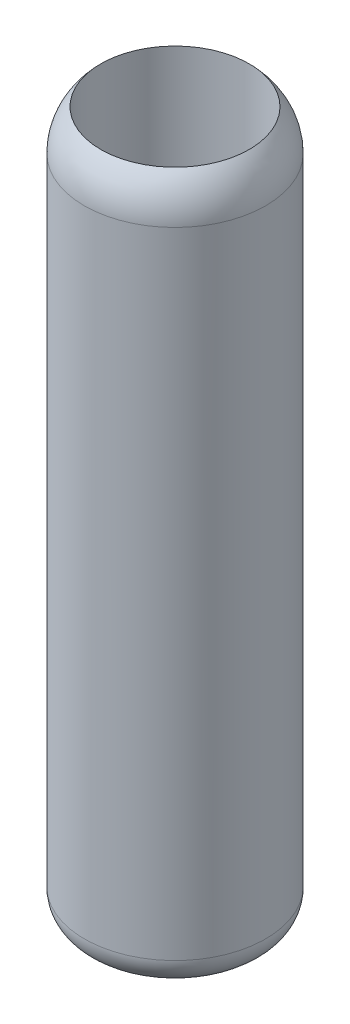
ISO-10303-21;
HEADER;
FILE_DESCRIPTION(('STEP AP214'),'2;1');
FILE_NAME('part.step','',(''),(''),'','','');
FILE_SCHEMA(('AUTOMOTIVE_DESIGN { 1 0 10303 214 1 1 1 1 }'));
ENDSEC;
DATA;
#1=APPLICATION_CONTEXT('core data for automotive mechanical design processes');
#2=APPLICATION_PROTOCOL_DEFINITION('international standard','automotive_design',2000,#1);
#3=PRODUCT_CONTEXT('',#1,'mechanical');
#4=PRODUCT('Part','Part','',(#3));
#5=PRODUCT_RELATED_PRODUCT_CATEGORY('part','',(#4));
#6=PRODUCT_DEFINITION_FORMATION('','',#4);
#7=PRODUCT_DEFINITION_CONTEXT('part definition',#1,'design');
#8=PRODUCT_DEFINITION('design','',#6,#7);
#9=PRODUCT_DEFINITION_SHAPE('','',#8);
#10=(LENGTH_UNIT() NAMED_UNIT(*) SI_UNIT(.MILLI.,.METRE.));
#11=(NAMED_UNIT(*) PLANE_ANGLE_UNIT() SI_UNIT($,.RADIAN.));
#12=(NAMED_UNIT(*) SI_UNIT($,.STERADIAN.) SOLID_ANGLE_UNIT());
#13=UNCERTAINTY_MEASURE_WITH_UNIT(LENGTH_MEASURE(1.E-05),#10,'distance_accuracy_value','');
#14=(GEOMETRIC_REPRESENTATION_CONTEXT(3) GLOBAL_UNCERTAINTY_ASSIGNED_CONTEXT((#13)) GLOBAL_UNIT_ASSIGNED_CONTEXT((#10,
#11,#12)) REPRESENTATION_CONTEXT('',''));
#15=CARTESIAN_POINT('',(0.,0.,0.));
#16=DIRECTION('',(0.,0.,1.));
#17=DIRECTION('',(1.,0.,0.));
#18=AXIS2_PLACEMENT_3D('',#15,#16,#17);
#19=CARTESIAN_POINT('',(0.,120.,0.));
#20=DIRECTION('',(0.,-1.,0.));
#21=DIRECTION('',(0.,0.,-1.));
#22=AXIS2_PLACEMENT_3D('',#19,#20,#21);
#23=CYLINDRICAL_SURFACE('',#22,15.5);
#24=CARTESIAN_POINT('',(0.,4.48998886412873,0.));
#25=DIRECTION('',(0.,-1.,0.));
#26=DIRECTION('',(0.,0.,-1.));
#27=AXIS2_PLACEMENT_3D('',#24,#25,#26);
#28=CIRCLE('',#27,15.5);
#29=CARTESIAN_POINT('',(0.,4.48998886412873,-15.5));
#30=VERTEX_POINT('',#29);
#31=EDGE_CURVE('E10',#30,#30,#28,.F.);
#32=ORIENTED_EDGE('',*,*,#31,.T.);
#33=EDGE_LOOP('',(#32));
#34=FACE_BOUND('',#33,.T.);
#35=CARTESIAN_POINT('',(0.,113.060259370841,0.));
#36=DIRECTION('',(0.,1.,0.));
#37=DIRECTION('',(0.,0.,1.));
#38=AXIS2_PLACEMENT_3D('',#35,#36,#37);
#39=CIRCLE('',#38,15.5);
#40=CARTESIAN_POINT('',(0.,113.060259370841,15.5));
#41=VERTEX_POINT('',#40);
#42=EDGE_CURVE('E38',#41,#41,#39,.F.);
#43=ORIENTED_EDGE('',*,*,#42,.T.);
#44=EDGE_LOOP('',(#43));
#45=FACE_BOUND('',#44,.T.);
#46=ADVANCED_FACE('F31',(#34,#45),#23,.T.);
#47=CARTESIAN_POINT('',(0.,120.,0.));
#48=DIRECTION('',(0.,-1.,0.));
#49=DIRECTION('',(0.,0.,-1.));
#50=AXIS2_PLACEMENT_3D('',#47,#48,#49);
#51=CYLINDRICAL_SURFACE('',#50,12.7);
#52=CARTESIAN_POINT('',(0.,120.,0.));
#53=DIRECTION('',(0.,1.,0.));
#54=DIRECTION('',(0.,0.,1.));
#55=AXIS2_PLACEMENT_3D('',#52,#53,#54);
#56=CIRCLE('',#55,12.7);
#57=CARTESIAN_POINT('',(0.,120.,12.7));
#58=VERTEX_POINT('',#57);
#59=EDGE_CURVE('E42',#58,#58,#56,.T.);
#60=ORIENTED_EDGE('',*,*,#59,.T.);
#61=EDGE_LOOP('',(#60));
#62=FACE_BOUND('',#61,.T.);
#63=CARTESIAN_POINT('',(0.,0.,0.));
#64=DIRECTION('',(0.,1.,0.));
#65=DIRECTION('',(0.,0.,1.));
#66=AXIS2_PLACEMENT_3D('',#63,#64,#65);
#67=CIRCLE('',#66,12.7);
#68=CARTESIAN_POINT('',(0.,0.,12.7));
#69=VERTEX_POINT('',#68);
#70=EDGE_CURVE('E46',#69,#69,#67,.T.);
#71=ORIENTED_EDGE('',*,*,#70,.F.);
#72=EDGE_LOOP('',(#71));
#73=FACE_BOUND('',#72,.T.);
#74=ADVANCED_FACE('F54',(#62,#73),#51,.F.);
#75=CARTESIAN_POINT('',(0.,113.060259370841,0.));
#76=DIRECTION('',(0.,1.,0.));
#77=DIRECTION('',(0.,0.,1.));
#78=AXIS2_PLACEMENT_3D('',#75,#76,#77);
#79=DEGENERATE_TOROIDAL_SURFACE('',#78,5.5,10.,.T.);
#80=ORIENTED_EDGE('',*,*,#42,.F.);
#81=EDGE_LOOP('',(#80));
#82=FACE_BOUND('',#81,.T.);
#83=ORIENTED_EDGE('',*,*,#59,.F.);
#84=EDGE_LOOP('',(#83));
#85=FACE_BOUND('',#84,.T.);
#86=ADVANCED_FACE('F56',(#82,#85),#79,.T.);
#87=CARTESIAN_POINT('',(0.,4.48998886412873,0.));
#88=DIRECTION('',(0.,-1.,0.));
#89=DIRECTION('',(0.,0.,-1.));
#90=AXIS2_PLACEMENT_3D('',#87,#88,#89);
#91=TOROIDAL_SURFACE('',#90,10.5,5.);
#92=ORIENTED_EDGE('',*,*,#70,.T.);
#93=EDGE_LOOP('',(#92));
#94=FACE_BOUND('',#93,.T.);
#95=ORIENTED_EDGE('',*,*,#31,.F.);
#96=EDGE_LOOP('',(#95));
#97=FACE_BOUND('',#96,.T.);
#98=ADVANCED_FACE('F33',(#94,#97),#91,.T.);
#99=CLOSED_SHELL('',(#46,#74,#86,#98));
#100=MANIFOLD_SOLID_BREP('B2',#99);
#101=ADVANCED_BREP_SHAPE_REPRESENTATION('',(#18,#100),#14);
#102=SHAPE_DEFINITION_REPRESENTATION(#9,#101);
ENDSEC;
END-ISO-10303-21;
